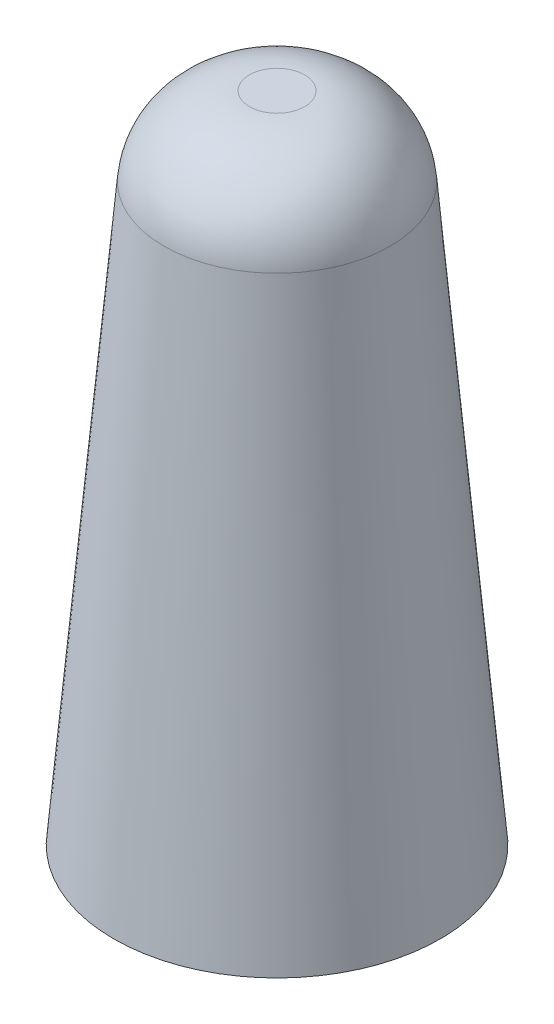
ISO-10303-21;
HEADER;
FILE_DESCRIPTION(('STEP AP214'),'2;1');
FILE_NAME('part.step','',(''),(''),'','','');
FILE_SCHEMA(('AUTOMOTIVE_DESIGN { 1 0 10303 214 1 1 1 1 }'));
ENDSEC;
DATA;
#1=APPLICATION_CONTEXT('core data for automotive mechanical design processes');
#2=APPLICATION_PROTOCOL_DEFINITION('international standard','automotive_design',2000,#1);
#3=PRODUCT_CONTEXT('',#1,'mechanical');
#4=PRODUCT('Part','Part','',(#3));
#5=PRODUCT_RELATED_PRODUCT_CATEGORY('part','',(#4));
#6=PRODUCT_DEFINITION_FORMATION('','',#4);
#7=PRODUCT_DEFINITION_CONTEXT('part definition',#1,'design');
#8=PRODUCT_DEFINITION('design','',#6,#7);
#9=PRODUCT_DEFINITION_SHAPE('','',#8);
#10=(LENGTH_UNIT() NAMED_UNIT(*) SI_UNIT(.MILLI.,.METRE.));
#11=(NAMED_UNIT(*) PLANE_ANGLE_UNIT() SI_UNIT($,.RADIAN.));
#12=(NAMED_UNIT(*) SI_UNIT($,.STERADIAN.) SOLID_ANGLE_UNIT());
#13=UNCERTAINTY_MEASURE_WITH_UNIT(LENGTH_MEASURE(1.E-05),#10,'distance_accuracy_value','');
#14=(GEOMETRIC_REPRESENTATION_CONTEXT(3) GLOBAL_UNCERTAINTY_ASSIGNED_CONTEXT((#13)) GLOBAL_UNIT_ASSIGNED_CONTEXT((#10,
#11,#12)) REPRESENTATION_CONTEXT('',''));
#15=CARTESIAN_POINT('',(0.,0.,0.));
#16=DIRECTION('',(0.,0.,1.));
#17=DIRECTION('',(1.,0.,0.));
#18=AXIS2_PLACEMENT_3D('',#15,#16,#17);
#19=CARTESIAN_POINT('',(0.,0.,0.));
#20=DIRECTION('',(0.,-1.,0.));
#21=DIRECTION('',(0.,0.,1.));
#22=AXIS2_PLACEMENT_3D('',#19,#20,#21);
#23=CONICAL_SURFACE('',#22,19.05,0.0872664625997165);
#24=CARTESIAN_POINT('',(0.,67.0715574274766,0.));
#25=DIRECTION('',(0.,-1.,0.));
#26=DIRECTION('',(0.,0.,-1.));
#27=AXIS2_PLACEMENT_3D('',#24,#25,#26);
#28=CIRCLE('',#27,13.1819990800678);
#29=CARTESIAN_POINT('',(0.,67.0715574274766,-13.1819990800678));
#30=VERTEX_POINT('',#29);
#31=EDGE_CURVE('E12',#30,#30,#28,.T.);
#32=ORIENTED_EDGE('',*,*,#31,.T.);
#33=EDGE_LOOP('',(#32));
#34=FACE_BOUND('',#33,.T.);
#35=CARTESIAN_POINT('',(0.,0.,0.));
#36=DIRECTION('',(0.,1.,0.));
#37=DIRECTION('',(0.,0.,1.));
#38=AXIS2_PLACEMENT_3D('',#35,#36,#37);
#39=CIRCLE('',#38,19.05);
#40=CARTESIAN_POINT('',(0.,0.,19.05));
#41=VERTEX_POINT('',#40);
#42=EDGE_CURVE('E55',#41,#41,#39,.T.);
#43=ORIENTED_EDGE('',*,*,#42,.T.);
#44=EDGE_LOOP('',(#43));
#45=FACE_BOUND('',#44,.T.);
#46=ADVANCED_FACE('F44',(#34,#45),#23,.T.);
#47=CARTESIAN_POINT('',(0.,76.2,0.));
#48=DIRECTION('',(0.,1.,0.));
#49=DIRECTION('',(0.,0.,1.));
#50=AXIS2_PLACEMENT_3D('',#47,#48,#49);
#51=PLANE('',#50);
#52=CARTESIAN_POINT('',(0.,76.2,0.));
#53=DIRECTION('',(0.,1.,0.));
#54=DIRECTION('',(0.,0.,1.));
#55=AXIS2_PLACEMENT_3D('',#52,#53,#54);
#56=CIRCLE('',#55,3.22005209915035);
#57=CARTESIAN_POINT('',(0.,76.2,3.22005209915035));
#58=VERTEX_POINT('',#57);
#59=EDGE_CURVE('E51',#58,#58,#56,.T.);
#60=ORIENTED_EDGE('',*,*,#59,.T.);
#61=EDGE_LOOP('',(#60));
#62=FACE_BOUND('',#61,.T.);
#63=ADVANCED_FACE('F65',(#62),#51,.T.);
#64=CARTESIAN_POINT('',(0.,0.,0.));
#65=DIRECTION('',(0.,1.,0.));
#66=DIRECTION('',(0.,0.,1.));
#67=AXIS2_PLACEMENT_3D('',#64,#65,#66);
#68=PLANE('',#67);
#69=ORIENTED_EDGE('',*,*,#42,.F.);
#70=EDGE_LOOP('',(#69));
#71=FACE_BOUND('',#70,.T.);
#72=ADVANCED_FACE('F63',(#71),#68,.F.);
#73=CARTESIAN_POINT('',(0.,66.2,0.));
#74=DIRECTION('',(0.,1.,0.));
#75=DIRECTION('',(0.,0.,1.));
#76=AXIS2_PLACEMENT_3D('',#73,#74,#75);
#77=DEGENERATE_TOROIDAL_SURFACE('',#76,3.22005209915035,10.,.T.);
#78=ORIENTED_EDGE('',*,*,#31,.F.);
#79=EDGE_LOOP('',(#78));
#80=FACE_BOUND('',#79,.T.);
#81=ORIENTED_EDGE('',*,*,#59,.F.);
#82=EDGE_LOOP('',(#81));
#83=FACE_BOUND('',#82,.T.);
#84=ADVANCED_FACE('F46',(#80,#83),#77,.T.);
#85=CLOSED_SHELL('',(#46,#63,#72,#84));
#86=MANIFOLD_SOLID_BREP('B2',#85);
#87=ADVANCED_BREP_SHAPE_REPRESENTATION('',(#18,#86),#14);
#88=SHAPE_DEFINITION_REPRESENTATION(#9,#87);
ENDSEC;
END-ISO-10303-21;
